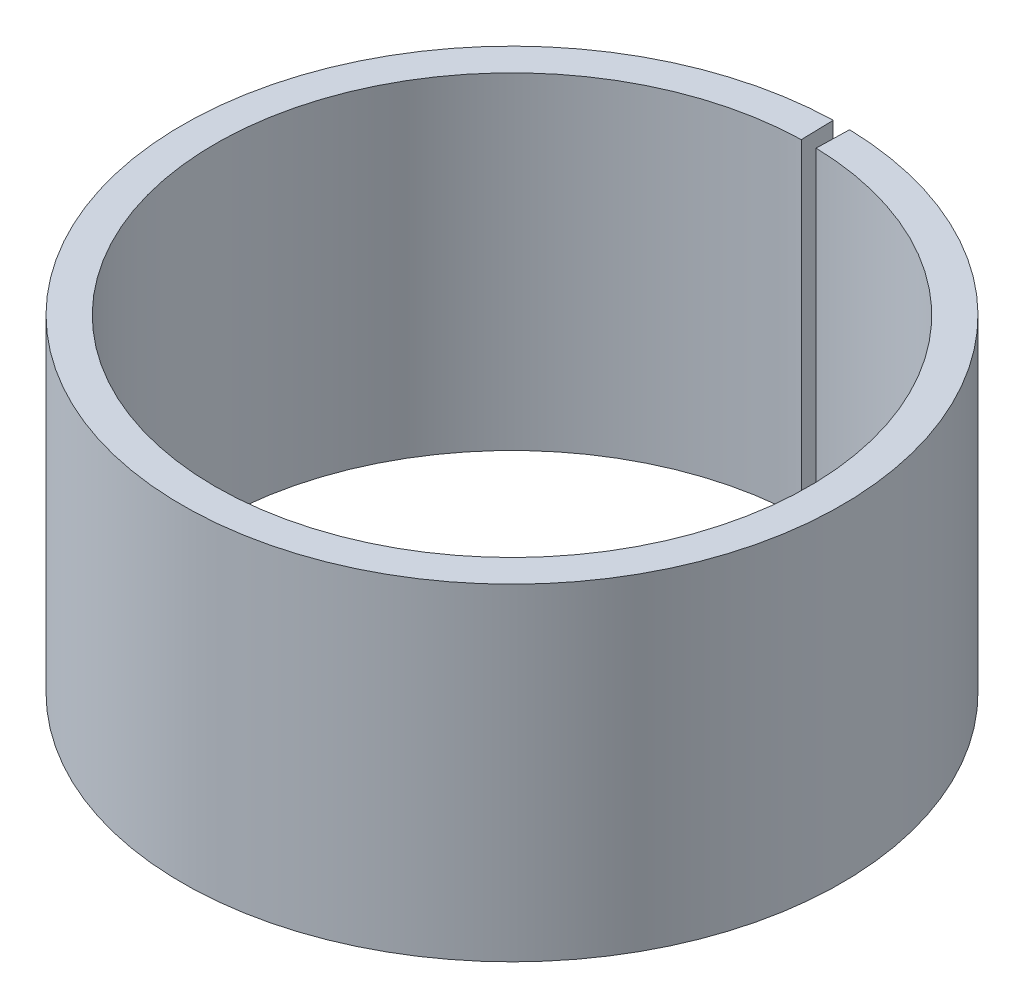
ISO-10303-21;
HEADER;
FILE_DESCRIPTION(('STEP AP214'),'2;1');
FILE_NAME('part.step','',(''),(''),'','','');
FILE_SCHEMA(('AUTOMOTIVE_DESIGN { 1 0 10303 214 1 1 1 1 }'));
ENDSEC;
DATA;
#1=APPLICATION_CONTEXT('core data for automotive mechanical design processes');
#2=APPLICATION_PROTOCOL_DEFINITION('international standard','automotive_design',2000,#1);
#3=PRODUCT_CONTEXT('',#1,'mechanical');
#4=PRODUCT('Part','Part','',(#3));
#5=PRODUCT_RELATED_PRODUCT_CATEGORY('part','',(#4));
#6=PRODUCT_DEFINITION_FORMATION('','',#4);
#7=PRODUCT_DEFINITION_CONTEXT('part definition',#1,'design');
#8=PRODUCT_DEFINITION('design','',#6,#7);
#9=PRODUCT_DEFINITION_SHAPE('','',#8);
#10=(LENGTH_UNIT() NAMED_UNIT(*) SI_UNIT(.MILLI.,.METRE.));
#11=(NAMED_UNIT(*) PLANE_ANGLE_UNIT() SI_UNIT($,.RADIAN.));
#12=(NAMED_UNIT(*) SI_UNIT($,.STERADIAN.) SOLID_ANGLE_UNIT());
#13=UNCERTAINTY_MEASURE_WITH_UNIT(LENGTH_MEASURE(1.E-05),#10,'distance_accuracy_value','');
#14=(GEOMETRIC_REPRESENTATION_CONTEXT(3) GLOBAL_UNCERTAINTY_ASSIGNED_CONTEXT((#13)) GLOBAL_UNIT_ASSIGNED_CONTEXT((#10,
#11,#12)) REPRESENTATION_CONTEXT('',''));
#15=CARTESIAN_POINT('',(0.,0.,0.));
#16=DIRECTION('',(0.,0.,1.));
#17=DIRECTION('',(1.,0.,0.));
#18=AXIS2_PLACEMENT_3D('',#15,#16,#17);
#19=CARTESIAN_POINT('',(0.,50.8,0.));
#20=DIRECTION('',(0.,-1.,0.));
#21=DIRECTION('',(0.,0.,-1.));
#22=AXIS2_PLACEMENT_3D('',#19,#20,#21);
#23=CYLINDRICAL_SURFACE('',#22,51.181);
#24=CARTESIAN_POINT('',(0.,0.,0.));
#25=DIRECTION('',(0.,1.,0.));
#26=DIRECTION('',(0.,0.,1.));
#27=AXIS2_PLACEMENT_3D('',#24,#25,#26);
#28=CIRCLE('',#27,51.181);
#29=CARTESIAN_POINT('',(-1.27,0.,-51.1652407499466));
#30=VERTEX_POINT('',#29);
#31=CARTESIAN_POINT('',(1.27,0.,-51.1652407499466));
#32=VERTEX_POINT('',#31);
#33=EDGE_CURVE('E100',#30,#32,#28,.T.);
#34=ORIENTED_EDGE('',*,*,#33,.T.);
#35=DIRECTION('',(0.,-1.,0.));
#36=VECTOR('',#35,1.);
#37=CARTESIAN_POINT('',(1.27,50.8,-51.1652407499466));
#38=LINE('',#37,#36);
#39=CARTESIAN_POINT('',(1.27,50.8,-51.1652407499466));
#40=VERTEX_POINT('',#39);
#41=EDGE_CURVE('E11',#40,#32,#38,.T.);
#42=ORIENTED_EDGE('',*,*,#41,.F.);
#43=CARTESIAN_POINT('',(0.,50.8,0.));
#44=DIRECTION('',(0.,1.,0.));
#45=DIRECTION('',(0.,0.,1.));
#46=AXIS2_PLACEMENT_3D('',#43,#44,#45);
#47=CIRCLE('',#46,51.181);
#48=CARTESIAN_POINT('',(-1.27,50.8,-51.1652407499466));
#49=VERTEX_POINT('',#48);
#50=EDGE_CURVE('E88',#49,#40,#47,.T.);
#51=ORIENTED_EDGE('',*,*,#50,.F.);
#52=DIRECTION('',(0.,-1.,0.));
#53=VECTOR('',#52,1.);
#54=CARTESIAN_POINT('',(-1.27,50.8,-51.1652407499466));
#55=LINE('',#54,#53);
#56=EDGE_CURVE('E96',#49,#30,#55,.T.);
#57=ORIENTED_EDGE('',*,*,#56,.T.);
#58=EDGE_LOOP('',(#34,#42,#51,#57));
#59=FACE_BOUND('',#58,.T.);
#60=ADVANCED_FACE('F37',(#59),#23,.T.);
#61=CARTESIAN_POINT('',(1.14394540942928,50.8,-46.0868049435003));
#62=DIRECTION('',(0.999692087883133,0.,0.0248138957816377));
#63=DIRECTION('',(0.0248138957816377,0.,-0.999692087883133));
#64=AXIS2_PLACEMENT_3D('',#61,#62,#63);
#65=PLANE('',#64);
#66=DIRECTION('',(-0.0248138957816377,0.,0.999692087883133));
#67=VECTOR('',#66,1.);
#68=CARTESIAN_POINT('',(1.14394540942928,0.,-46.0868049435003));
#69=LINE('',#68,#67);
#70=CARTESIAN_POINT('',(1.14394540942928,0.,-46.0868049435003));
#71=VERTEX_POINT('',#70);
#72=EDGE_CURVE('E92',#32,#71,#69,.T.);
#73=ORIENTED_EDGE('',*,*,#72,.T.);
#74=DIRECTION('',(0.,-1.,0.));
#75=VECTOR('',#74,1.);
#76=CARTESIAN_POINT('',(1.14394540942928,50.8,-46.0868049435003));
#77=LINE('',#76,#75);
#78=CARTESIAN_POINT('',(1.14394540942928,50.8,-46.0868049435003));
#79=VERTEX_POINT('',#78);
#80=EDGE_CURVE('E45',#79,#71,#77,.T.);
#81=ORIENTED_EDGE('',*,*,#80,.F.);
#82=DIRECTION('',(-0.0248138957816377,0.,0.999692087883133));
#83=VECTOR('',#82,1.);
#84=CARTESIAN_POINT('',(1.14394540942928,50.8,-46.0868049435003));
#85=LINE('',#84,#83);
#86=EDGE_CURVE('E83',#40,#79,#85,.T.);
#87=ORIENTED_EDGE('',*,*,#86,.F.);
#88=ORIENTED_EDGE('',*,*,#41,.T.);
#89=EDGE_LOOP('',(#73,#81,#87,#88));
#90=FACE_BOUND('',#89,.T.);
#91=ADVANCED_FACE('F91',(#90),#65,.F.);
#92=CARTESIAN_POINT('',(0.,50.8,0.));
#93=DIRECTION('',(0.,-1.,0.));
#94=DIRECTION('',(0.,0.,-1.));
#95=AXIS2_PLACEMENT_3D('',#92,#93,#94);
#96=CYLINDRICAL_SURFACE('',#95,46.101);
#97=CARTESIAN_POINT('',(0.,0.,0.));
#98=DIRECTION('',(0.,-1.,0.));
#99=DIRECTION('',(0.,0.,1.));
#100=AXIS2_PLACEMENT_3D('',#97,#98,#99);
#101=CIRCLE('',#100,46.101);
#102=CARTESIAN_POINT('',(-1.14394540942928,0.,-46.0868049435003));
#103=VERTEX_POINT('',#102);
#104=EDGE_CURVE('E70',#71,#103,#101,.T.);
#105=ORIENTED_EDGE('',*,*,#104,.T.);
#106=DIRECTION('',(0.,-1.,0.));
#107=VECTOR('',#106,1.);
#108=CARTESIAN_POINT('',(-1.14394540942928,50.8,-46.0868049435003));
#109=LINE('',#108,#107);
#110=CARTESIAN_POINT('',(-1.14394540942928,50.8,-46.0868049435003));
#111=VERTEX_POINT('',#110);
#112=EDGE_CURVE('E93',#111,#103,#109,.T.);
#113=ORIENTED_EDGE('',*,*,#112,.F.);
#114=CARTESIAN_POINT('',(0.,50.8,0.));
#115=DIRECTION('',(0.,-1.,0.));
#116=DIRECTION('',(0.,0.,1.));
#117=AXIS2_PLACEMENT_3D('',#114,#115,#116);
#118=CIRCLE('',#117,46.101);
#119=EDGE_CURVE('E86',#79,#111,#118,.T.);
#120=ORIENTED_EDGE('',*,*,#119,.F.);
#121=ORIENTED_EDGE('',*,*,#80,.T.);
#122=EDGE_LOOP('',(#105,#113,#120,#121));
#123=FACE_BOUND('',#122,.T.);
#124=ADVANCED_FACE('F94',(#123),#96,.F.);
#125=CARTESIAN_POINT('',(-1.14394540942928,50.8,-46.0868049435003));
#126=DIRECTION('',(-0.999692087883133,0.,0.0248138957816377));
#127=DIRECTION('',(0.0248138957816377,0.,0.999692087883133));
#128=AXIS2_PLACEMENT_3D('',#125,#126,#127);
#129=PLANE('',#128);
#130=DIRECTION('',(-0.0248138957816377,0.,-0.999692087883133));
#131=VECTOR('',#130,1.);
#132=CARTESIAN_POINT('',(-1.14394540942928,0.,-46.0868049435003));
#133=LINE('',#132,#131);
#134=EDGE_CURVE('E76',#103,#30,#133,.T.);
#135=ORIENTED_EDGE('',*,*,#134,.T.);
#136=ORIENTED_EDGE('',*,*,#56,.F.);
#137=DIRECTION('',(-0.0248138957816377,0.,-0.999692087883133));
#138=VECTOR('',#137,1.);
#139=CARTESIAN_POINT('',(-1.14394540942928,50.8,-46.0868049435003));
#140=LINE('',#139,#138);
#141=EDGE_CURVE('E53',#111,#49,#140,.T.);
#142=ORIENTED_EDGE('',*,*,#141,.F.);
#143=ORIENTED_EDGE('',*,*,#112,.T.);
#144=EDGE_LOOP('',(#135,#136,#142,#143));
#145=FACE_BOUND('',#144,.T.);
#146=ADVANCED_FACE('F107',(#145),#129,.F.);
#147=CARTESIAN_POINT('',(0.,50.8,0.));
#148=DIRECTION('',(0.,1.,0.));
#149=DIRECTION('',(0.,0.,1.));
#150=AXIS2_PLACEMENT_3D('',#147,#148,#149);
#151=PLANE('',#150);
#152=ORIENTED_EDGE('',*,*,#50,.T.);
#153=ORIENTED_EDGE('',*,*,#86,.T.);
#154=ORIENTED_EDGE('',*,*,#119,.T.);
#155=ORIENTED_EDGE('',*,*,#141,.T.);
#156=EDGE_LOOP('',(#152,#153,#154,#155));
#157=FACE_BOUND('',#156,.T.);
#158=ADVANCED_FACE('F84',(#157),#151,.T.);
#159=CARTESIAN_POINT('',(0.,0.,0.));
#160=DIRECTION('',(0.,1.,0.));
#161=DIRECTION('',(0.,0.,1.));
#162=AXIS2_PLACEMENT_3D('',#159,#160,#161);
#163=PLANE('',#162);
#164=ORIENTED_EDGE('',*,*,#33,.F.);
#165=ORIENTED_EDGE('',*,*,#134,.F.);
#166=ORIENTED_EDGE('',*,*,#104,.F.);
#167=ORIENTED_EDGE('',*,*,#72,.F.);
#168=EDGE_LOOP('',(#164,#165,#166,#167));
#169=FACE_BOUND('',#168,.T.);
#170=ADVANCED_FACE('F110',(#169),#163,.F.);
#171=CLOSED_SHELL('',(#60,#91,#124,#146,#158,#170));
#172=MANIFOLD_SOLID_BREP('B2',#171);
#173=ADVANCED_BREP_SHAPE_REPRESENTATION('',(#18,#172),#14);
#174=SHAPE_DEFINITION_REPRESENTATION(#9,#173);
ENDSEC;
END-ISO-10303-21;
